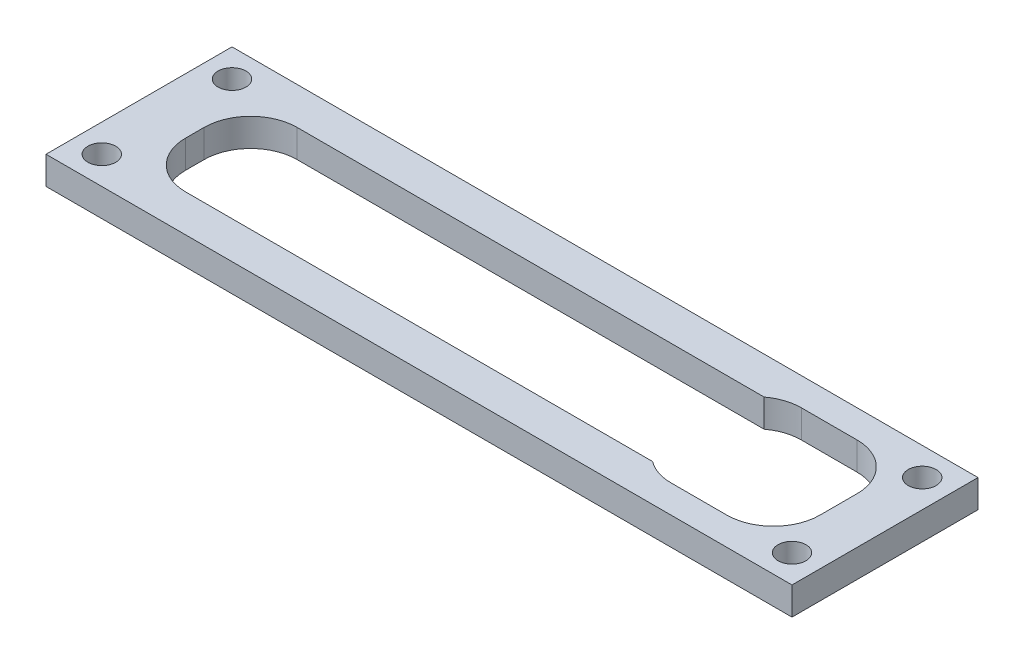
ISO-10303-21;
HEADER;
FILE_DESCRIPTION(('STEP AP214'),'2;1');
FILE_NAME('part.step','',(''),(''),'','','');
FILE_SCHEMA(('AUTOMOTIVE_DESIGN { 1 0 10303 214 1 1 1 1 }'));
ENDSEC;
DATA;
#1=APPLICATION_CONTEXT('core data for automotive mechanical design processes');
#2=APPLICATION_PROTOCOL_DEFINITION('international standard','automotive_design',2000,#1);
#3=PRODUCT_CONTEXT('',#1,'mechanical');
#4=PRODUCT('Part','Part','',(#3));
#5=PRODUCT_RELATED_PRODUCT_CATEGORY('part','',(#4));
#6=PRODUCT_DEFINITION_FORMATION('','',#4);
#7=PRODUCT_DEFINITION_CONTEXT('part definition',#1,'design');
#8=PRODUCT_DEFINITION('design','',#6,#7);
#9=PRODUCT_DEFINITION_SHAPE('','',#8);
#10=(LENGTH_UNIT() NAMED_UNIT(*) SI_UNIT(.MILLI.,.METRE.));
#11=(NAMED_UNIT(*) PLANE_ANGLE_UNIT() SI_UNIT($,.RADIAN.));
#12=(NAMED_UNIT(*) SI_UNIT($,.STERADIAN.) SOLID_ANGLE_UNIT());
#13=UNCERTAINTY_MEASURE_WITH_UNIT(LENGTH_MEASURE(1.E-05),#10,'distance_accuracy_value','');
#14=(GEOMETRIC_REPRESENTATION_CONTEXT(3) GLOBAL_UNCERTAINTY_ASSIGNED_CONTEXT((#13)) GLOBAL_UNIT_ASSIGNED_CONTEXT((#10,
#11,#12)) REPRESENTATION_CONTEXT('',''));
#15=CARTESIAN_POINT('',(0.,0.,0.));
#16=DIRECTION('',(0.,0.,1.));
#17=DIRECTION('',(1.,0.,0.));
#18=AXIS2_PLACEMENT_3D('',#15,#16,#17);
#19=CARTESIAN_POINT('',(0.,3.,0.));
#20=DIRECTION('',(0.,-1.,0.));
#21=DIRECTION('',(0.,0.,-1.));
#22=AXIS2_PLACEMENT_3D('',#19,#20,#21);
#23=PLANE('',#22);
#24=DIRECTION('',(0.,0.,1.));
#25=VECTOR('',#24,1.);
#26=CARTESIAN_POINT('',(0.,3.,0.));
#27=LINE('',#26,#25);
#28=CARTESIAN_POINT('',(0.,3.,-20.));
#29=VERTEX_POINT('',#28);
#30=CARTESIAN_POINT('',(0.,3.,0.));
#31=VERTEX_POINT('',#30);
#32=EDGE_CURVE('E250',#29,#31,#27,.T.);
#33=ORIENTED_EDGE('',*,*,#32,.T.);
#34=DIRECTION('',(1.,0.,0.));
#35=VECTOR('',#34,1.);
#36=CARTESIAN_POINT('',(0.,3.,0.));
#37=LINE('',#36,#35);
#38=CARTESIAN_POINT('',(80.2139109024275,3.,0.));
#39=VERTEX_POINT('',#38);
#40=EDGE_CURVE('E253',#31,#39,#37,.T.);
#41=ORIENTED_EDGE('',*,*,#40,.T.);
#42=DIRECTION('',(0.,0.,-1.));
#43=VECTOR('',#42,1.);
#44=CARTESIAN_POINT('',(80.2139109024275,3.,0.));
#45=LINE('',#44,#43);
#46=CARTESIAN_POINT('',(80.2139109024275,3.,-20.));
#47=VERTEX_POINT('',#46);
#48=EDGE_CURVE('E256',#39,#47,#45,.T.);
#49=ORIENTED_EDGE('',*,*,#48,.T.);
#50=DIRECTION('',(-1.,0.,0.));
#51=VECTOR('',#50,1.);
#52=CARTESIAN_POINT('',(0.,3.,-20.));
#53=LINE('',#52,#51);
#54=EDGE_CURVE('E258',#47,#29,#53,.T.);
#55=ORIENTED_EDGE('',*,*,#54,.T.);
#56=EDGE_LOOP('',(#33,#41,#49,#55));
#57=FACE_BOUND('',#56,.T.);
#58=DIRECTION('',(-1.,0.,0.));
#59=VECTOR('',#58,1.);
#60=CARTESIAN_POINT('',(5.99999999999999,3.,-16.));
#61=LINE('',#60,#59);
#62=CARTESIAN_POINT('',(61.2139109024274,3.,-16.));
#63=VERTEX_POINT('',#62);
#64=CARTESIAN_POINT('',(11.,3.,-16.));
#65=VERTEX_POINT('',#64);
#66=EDGE_CURVE('E243',#63,#65,#61,.T.);
#67=ORIENTED_EDGE('',*,*,#66,.F.);
#68=CARTESIAN_POINT('',(64.2139109024274,3.,-12.));
#69=DIRECTION('',(0.,-1.,0.));
#70=DIRECTION('',(0.,0.,-1.));
#71=AXIS2_PLACEMENT_3D('',#68,#69,#70);
#72=CIRCLE('',#71,5.);
#73=CARTESIAN_POINT('',(64.2139109024274,3.,-17.));
#74=VERTEX_POINT('',#73);
#75=EDGE_CURVE('E193',#63,#74,#72,.T.);
#76=ORIENTED_EDGE('',*,*,#75,.T.);
#77=DIRECTION('',(-1.,0.,0.));
#78=VECTOR('',#77,1.);
#79=CARTESIAN_POINT('',(61.2139109024274,3.,-17.));
#80=LINE('',#79,#78);
#81=CARTESIAN_POINT('',(70.2139109024274,3.,-17.));
#82=VERTEX_POINT('',#81);
#83=EDGE_CURVE('E205',#82,#74,#80,.T.);
#84=ORIENTED_EDGE('',*,*,#83,.F.);
#85=CARTESIAN_POINT('',(70.2139109024274,3.,-12.));
#86=DIRECTION('',(0.,-1.,0.));
#87=DIRECTION('',(0.,0.,-1.));
#88=AXIS2_PLACEMENT_3D('',#85,#86,#87);
#89=CIRCLE('',#88,5.);
#90=CARTESIAN_POINT('',(75.2139109024274,3.,-12.));
#91=VERTEX_POINT('',#90);
#92=EDGE_CURVE('E185',#82,#91,#89,.T.);
#93=ORIENTED_EDGE('',*,*,#92,.T.);
#94=DIRECTION('',(0.,0.,-1.));
#95=VECTOR('',#94,1.);
#96=CARTESIAN_POINT('',(75.2139109024274,3.,-17.));
#97=LINE('',#96,#95);
#98=CARTESIAN_POINT('',(75.2139109024274,3.,-8.00000000000002));
#99=VERTEX_POINT('',#98);
#100=EDGE_CURVE('E202',#99,#91,#97,.T.);
#101=ORIENTED_EDGE('',*,*,#100,.F.);
#102=CARTESIAN_POINT('',(70.2139109024274,3.,-8.00000000000002));
#103=DIRECTION('',(0.,-1.,0.));
#104=DIRECTION('',(0.,0.,-1.));
#105=AXIS2_PLACEMENT_3D('',#102,#103,#104);
#106=CIRCLE('',#105,5.);
#107=CARTESIAN_POINT('',(70.2139109024274,3.,-3.00000000000001));
#108=VERTEX_POINT('',#107);
#109=EDGE_CURVE('E189',#99,#108,#106,.T.);
#110=ORIENTED_EDGE('',*,*,#109,.T.);
#111=DIRECTION('',(1.,0.,0.));
#112=VECTOR('',#111,1.);
#113=CARTESIAN_POINT('',(61.2139109024274,3.,-3.00000000000001));
#114=LINE('',#113,#112);
#115=CARTESIAN_POINT('',(64.2139109024274,3.,-3.00000000000001));
#116=VERTEX_POINT('',#115);
#117=EDGE_CURVE('E200',#116,#108,#114,.T.);
#118=ORIENTED_EDGE('',*,*,#117,.F.);
#119=CARTESIAN_POINT('',(64.2139109024274,3.,-8.00000000000001));
#120=DIRECTION('',(0.,-1.,0.));
#121=DIRECTION('',(0.,0.,-1.));
#122=AXIS2_PLACEMENT_3D('',#119,#120,#121);
#123=CIRCLE('',#122,5.);
#124=CARTESIAN_POINT('',(61.2139109024274,3.,-4.00000000000001));
#125=VERTEX_POINT('',#124);
#126=EDGE_CURVE('E43',#116,#125,#123,.T.);
#127=ORIENTED_EDGE('',*,*,#126,.T.);
#128=DIRECTION('',(1.,0.,0.));
#129=VECTOR('',#128,1.);
#130=CARTESIAN_POINT('',(5.99999999999999,3.,-4.00000000000002));
#131=LINE('',#130,#129);
#132=CARTESIAN_POINT('',(11.,3.,-4.00000000000002));
#133=VERTEX_POINT('',#132);
#134=EDGE_CURVE('E162',#133,#125,#131,.T.);
#135=ORIENTED_EDGE('',*,*,#134,.F.);
#136=CARTESIAN_POINT('',(11.,3.,-9.00000000000001));
#137=DIRECTION('',(0.,-1.,0.));
#138=DIRECTION('',(0.,0.,-1.));
#139=AXIS2_PLACEMENT_3D('',#136,#137,#138);
#140=CIRCLE('',#139,5.);
#141=CARTESIAN_POINT('',(5.99999999999999,3.,-9.00000000000001));
#142=VERTEX_POINT('',#141);
#143=EDGE_CURVE('E179',#133,#142,#140,.T.);
#144=ORIENTED_EDGE('',*,*,#143,.T.);
#145=DIRECTION('',(0.,0.,1.));
#146=VECTOR('',#145,1.);
#147=CARTESIAN_POINT('',(5.99999999999999,3.,-16.));
#148=LINE('',#147,#146);
#149=CARTESIAN_POINT('',(5.99999999999999,3.,-11.));
#150=VERTEX_POINT('',#149);
#151=EDGE_CURVE('E239',#150,#142,#148,.T.);
#152=ORIENTED_EDGE('',*,*,#151,.F.);
#153=CARTESIAN_POINT('',(11.,3.,-11.));
#154=DIRECTION('',(0.,-1.,0.));
#155=DIRECTION('',(0.,0.,-1.));
#156=AXIS2_PLACEMENT_3D('',#153,#154,#155);
#157=CIRCLE('',#156,5.);
#158=EDGE_CURVE('E183',#150,#65,#157,.T.);
#159=ORIENTED_EDGE('',*,*,#158,.T.);
#160=EDGE_LOOP('',(#67,#76,#84,#93,#101,#110,#118,#127,#135,#144,#152,#159));
#161=FACE_BOUND('',#160,.T.);
#162=CARTESIAN_POINT('',(3.,3.,-17.));
#163=DIRECTION('',(0.,1.,0.));
#164=DIRECTION('',(0.,0.,1.));
#165=AXIS2_PLACEMENT_3D('',#162,#163,#164);
#166=CIRCLE('',#165,1.5);
#167=CARTESIAN_POINT('',(3.,3.,-15.5));
#168=VERTEX_POINT('',#167);
#169=EDGE_CURVE('E234',#168,#168,#166,.T.);
#170=ORIENTED_EDGE('',*,*,#169,.F.);
#171=EDGE_LOOP('',(#170));
#172=FACE_BOUND('',#171,.T.);
#173=CARTESIAN_POINT('',(3.,3.,-3.));
#174=DIRECTION('',(0.,1.,0.));
#175=DIRECTION('',(0.,0.,-1.));
#176=AXIS2_PLACEMENT_3D('',#173,#174,#175);
#177=CIRCLE('',#176,1.5);
#178=CARTESIAN_POINT('',(3.,3.,-4.5));
#179=VERTEX_POINT('',#178);
#180=EDGE_CURVE('E228',#179,#179,#177,.T.);
#181=ORIENTED_EDGE('',*,*,#180,.F.);
#182=EDGE_LOOP('',(#181));
#183=FACE_BOUND('',#182,.T.);
#184=CARTESIAN_POINT('',(77.2139109024275,3.,-3.00000000000001));
#185=DIRECTION('',(0.,1.,0.));
#186=DIRECTION('',(0.,0.,1.));
#187=AXIS2_PLACEMENT_3D('',#184,#185,#186);
#188=CIRCLE('',#187,1.5);
#189=CARTESIAN_POINT('',(77.2139109024275,3.,-1.50000000000001));
#190=VERTEX_POINT('',#189);
#191=EDGE_CURVE('E222',#190,#190,#188,.T.);
#192=ORIENTED_EDGE('',*,*,#191,.F.);
#193=EDGE_LOOP('',(#192));
#194=FACE_BOUND('',#193,.T.);
#195=CARTESIAN_POINT('',(77.2139109024275,3.,-17.));
#196=DIRECTION('',(0.,1.,0.));
#197=DIRECTION('',(0.,0.,-1.));
#198=AXIS2_PLACEMENT_3D('',#195,#196,#197);
#199=CIRCLE('',#198,1.5);
#200=CARTESIAN_POINT('',(77.2139109024275,3.,-18.5));
#201=VERTEX_POINT('',#200);
#202=EDGE_CURVE('E216',#201,#201,#199,.T.);
#203=ORIENTED_EDGE('',*,*,#202,.F.);
#204=EDGE_LOOP('',(#203));
#205=FACE_BOUND('',#204,.T.);
#206=ADVANCED_FACE('F35',(#57,#161,#172,#183,#194,#205),#23,.F.);
#207=CARTESIAN_POINT('',(0.,0.,0.));
#208=DIRECTION('',(0.,-1.,0.));
#209=DIRECTION('',(0.,0.,-1.));
#210=AXIS2_PLACEMENT_3D('',#207,#208,#209);
#211=PLANE('',#210);
#212=DIRECTION('',(-1.,0.,0.));
#213=VECTOR('',#212,1.);
#214=CARTESIAN_POINT('',(61.2139109024274,0.,-17.));
#215=LINE('',#214,#213);
#216=CARTESIAN_POINT('',(70.2139109024274,0.,-17.));
#217=VERTEX_POINT('',#216);
#218=CARTESIAN_POINT('',(64.2139109024274,0.,-17.));
#219=VERTEX_POINT('',#218);
#220=EDGE_CURVE('E165',#217,#219,#215,.T.);
#221=ORIENTED_EDGE('',*,*,#220,.T.);
#222=CARTESIAN_POINT('',(64.2139109024274,0.,-12.));
#223=DIRECTION('',(0.,-1.,0.));
#224=DIRECTION('',(0.,0.,-1.));
#225=AXIS2_PLACEMENT_3D('',#222,#223,#224);
#226=CIRCLE('',#225,5.);
#227=CARTESIAN_POINT('',(61.2139109024274,0.,-16.));
#228=VERTEX_POINT('',#227);
#229=EDGE_CURVE('E195',#219,#228,#226,.F.);
#230=ORIENTED_EDGE('',*,*,#229,.T.);
#231=DIRECTION('',(-1.,0.,0.));
#232=VECTOR('',#231,1.);
#233=CARTESIAN_POINT('',(5.99999999999999,0.,-16.));
#234=LINE('',#233,#232);
#235=CARTESIAN_POINT('',(11.,0.,-16.));
#236=VERTEX_POINT('',#235);
#237=EDGE_CURVE('E154',#228,#236,#234,.T.);
#238=ORIENTED_EDGE('',*,*,#237,.T.);
#239=CARTESIAN_POINT('',(11.,0.,-11.));
#240=DIRECTION('',(0.,-1.,0.));
#241=DIRECTION('',(0.,0.,-1.));
#242=AXIS2_PLACEMENT_3D('',#239,#240,#241);
#243=CIRCLE('',#242,5.);
#244=CARTESIAN_POINT('',(5.99999999999999,0.,-11.));
#245=VERTEX_POINT('',#244);
#246=EDGE_CURVE('E181',#236,#245,#243,.F.);
#247=ORIENTED_EDGE('',*,*,#246,.T.);
#248=DIRECTION('',(0.,0.,1.));
#249=VECTOR('',#248,1.);
#250=CARTESIAN_POINT('',(5.99999999999999,0.,-16.));
#251=LINE('',#250,#249);
#252=CARTESIAN_POINT('',(5.99999999999999,0.,-9.00000000000001));
#253=VERTEX_POINT('',#252);
#254=EDGE_CURVE('E155',#245,#253,#251,.T.);
#255=ORIENTED_EDGE('',*,*,#254,.T.);
#256=CARTESIAN_POINT('',(11.,0.,-9.00000000000001));
#257=DIRECTION('',(0.,-1.,0.));
#258=DIRECTION('',(0.,0.,-1.));
#259=AXIS2_PLACEMENT_3D('',#256,#257,#258);
#260=CIRCLE('',#259,5.);
#261=CARTESIAN_POINT('',(11.,0.,-4.00000000000002));
#262=VERTEX_POINT('',#261);
#263=EDGE_CURVE('E151',#253,#262,#260,.F.);
#264=ORIENTED_EDGE('',*,*,#263,.T.);
#265=DIRECTION('',(1.,0.,0.));
#266=VECTOR('',#265,1.);
#267=CARTESIAN_POINT('',(5.99999999999999,0.,-4.00000000000002));
#268=LINE('',#267,#266);
#269=CARTESIAN_POINT('',(61.2139109024274,0.,-4.00000000000001));
#270=VERTEX_POINT('',#269);
#271=EDGE_CURVE('E145',#262,#270,#268,.T.);
#272=ORIENTED_EDGE('',*,*,#271,.T.);
#273=CARTESIAN_POINT('',(64.2139109024274,0.,-8.00000000000001));
#274=DIRECTION('',(0.,-1.,0.));
#275=DIRECTION('',(0.,0.,-1.));
#276=AXIS2_PLACEMENT_3D('',#273,#274,#275);
#277=CIRCLE('',#276,5.);
#278=CARTESIAN_POINT('',(64.2139109024274,0.,-3.00000000000001));
#279=VERTEX_POINT('',#278);
#280=EDGE_CURVE('E11',#270,#279,#277,.F.);
#281=ORIENTED_EDGE('',*,*,#280,.T.);
#282=DIRECTION('',(1.,0.,0.));
#283=VECTOR('',#282,1.);
#284=CARTESIAN_POINT('',(61.2139109024274,0.,-3.00000000000001));
#285=LINE('',#284,#283);
#286=CARTESIAN_POINT('',(70.2139109024274,0.,-3.00000000000001));
#287=VERTEX_POINT('',#286);
#288=EDGE_CURVE('E212',#279,#287,#285,.T.);
#289=ORIENTED_EDGE('',*,*,#288,.T.);
#290=CARTESIAN_POINT('',(70.2139109024274,0.,-8.00000000000002));
#291=DIRECTION('',(0.,-1.,0.));
#292=DIRECTION('',(0.,0.,-1.));
#293=AXIS2_PLACEMENT_3D('',#290,#291,#292);
#294=CIRCLE('',#293,5.);
#295=CARTESIAN_POINT('',(75.2139109024274,0.,-8.00000000000002));
#296=VERTEX_POINT('',#295);
#297=EDGE_CURVE('E191',#287,#296,#294,.F.);
#298=ORIENTED_EDGE('',*,*,#297,.T.);
#299=DIRECTION('',(0.,0.,-1.));
#300=VECTOR('',#299,1.);
#301=CARTESIAN_POINT('',(75.2139109024274,0.,-17.));
#302=LINE('',#301,#300);
#303=CARTESIAN_POINT('',(75.2139109024274,0.,-12.));
#304=VERTEX_POINT('',#303);
#305=EDGE_CURVE('E300',#296,#304,#302,.T.);
#306=ORIENTED_EDGE('',*,*,#305,.T.);
#307=CARTESIAN_POINT('',(70.2139109024274,0.,-12.));
#308=DIRECTION('',(0.,-1.,0.));
#309=DIRECTION('',(0.,0.,-1.));
#310=AXIS2_PLACEMENT_3D('',#307,#308,#309);
#311=CIRCLE('',#310,5.);
#312=EDGE_CURVE('E187',#304,#217,#311,.F.);
#313=ORIENTED_EDGE('',*,*,#312,.T.);
#314=EDGE_LOOP('',(#221,#230,#238,#247,#255,#264,#272,#281,#289,#298,#306,#313));
#315=FACE_BOUND('',#314,.T.);
#316=CARTESIAN_POINT('',(77.2139109024275,0.,-3.00000000000001));
#317=DIRECTION('',(0.,1.,0.));
#318=DIRECTION('',(0.,0.,1.));
#319=AXIS2_PLACEMENT_3D('',#316,#317,#318);
#320=CIRCLE('',#319,1.5);
#321=CARTESIAN_POINT('',(77.2139109024275,0.,-1.50000000000001));
#322=VERTEX_POINT('',#321);
#323=EDGE_CURVE('E219',#322,#322,#320,.T.);
#324=ORIENTED_EDGE('',*,*,#323,.T.);
#325=EDGE_LOOP('',(#324));
#326=FACE_BOUND('',#325,.T.);
#327=CARTESIAN_POINT('',(3.,0.,-17.));
#328=DIRECTION('',(0.,1.,0.));
#329=DIRECTION('',(0.,0.,1.));
#330=AXIS2_PLACEMENT_3D('',#327,#328,#329);
#331=CIRCLE('',#330,1.5);
#332=CARTESIAN_POINT('',(3.,0.,-15.5));
#333=VERTEX_POINT('',#332);
#334=EDGE_CURVE('E231',#333,#333,#331,.T.);
#335=ORIENTED_EDGE('',*,*,#334,.T.);
#336=EDGE_LOOP('',(#335));
#337=FACE_BOUND('',#336,.T.);
#338=DIRECTION('',(0.,0.,1.));
#339=VECTOR('',#338,1.);
#340=CARTESIAN_POINT('',(0.,0.,0.));
#341=LINE('',#340,#339);
#342=CARTESIAN_POINT('',(0.,0.,-20.));
#343=VERTEX_POINT('',#342);
#344=CARTESIAN_POINT('',(0.,0.,0.));
#345=VERTEX_POINT('',#344);
#346=EDGE_CURVE('E246',#343,#345,#341,.T.);
#347=ORIENTED_EDGE('',*,*,#346,.F.);
#348=DIRECTION('',(-1.,0.,0.));
#349=VECTOR('',#348,1.);
#350=CARTESIAN_POINT('',(0.,0.,-20.));
#351=LINE('',#350,#349);
#352=CARTESIAN_POINT('',(80.2139109024275,0.,-20.));
#353=VERTEX_POINT('',#352);
#354=EDGE_CURVE('E254',#353,#343,#351,.T.);
#355=ORIENTED_EDGE('',*,*,#354,.F.);
#356=DIRECTION('',(0.,0.,-1.));
#357=VECTOR('',#356,1.);
#358=CARTESIAN_POINT('',(80.2139109024275,0.,0.));
#359=LINE('',#358,#357);
#360=CARTESIAN_POINT('',(80.2139109024275,0.,0.));
#361=VERTEX_POINT('',#360);
#362=EDGE_CURVE('E265',#361,#353,#359,.T.);
#363=ORIENTED_EDGE('',*,*,#362,.F.);
#364=DIRECTION('',(1.,0.,0.));
#365=VECTOR('',#364,1.);
#366=CARTESIAN_POINT('',(0.,0.,0.));
#367=LINE('',#366,#365);
#368=EDGE_CURVE('E263',#345,#361,#367,.T.);
#369=ORIENTED_EDGE('',*,*,#368,.F.);
#370=EDGE_LOOP('',(#347,#355,#363,#369));
#371=FACE_BOUND('',#370,.T.);
#372=CARTESIAN_POINT('',(3.,0.,-3.));
#373=DIRECTION('',(0.,1.,0.));
#374=DIRECTION('',(0.,0.,-1.));
#375=AXIS2_PLACEMENT_3D('',#372,#373,#374);
#376=CIRCLE('',#375,1.5);
#377=CARTESIAN_POINT('',(3.,0.,-4.5));
#378=VERTEX_POINT('',#377);
#379=EDGE_CURVE('E225',#378,#378,#376,.T.);
#380=ORIENTED_EDGE('',*,*,#379,.T.);
#381=EDGE_LOOP('',(#380));
#382=FACE_BOUND('',#381,.T.);
#383=CARTESIAN_POINT('',(77.2139109024275,0.,-17.));
#384=DIRECTION('',(0.,1.,0.));
#385=DIRECTION('',(0.,0.,-1.));
#386=AXIS2_PLACEMENT_3D('',#383,#384,#385);
#387=CIRCLE('',#386,1.5);
#388=CARTESIAN_POINT('',(77.2139109024275,0.,-18.5));
#389=VERTEX_POINT('',#388);
#390=EDGE_CURVE('E214',#389,#389,#387,.T.);
#391=ORIENTED_EDGE('',*,*,#390,.T.);
#392=EDGE_LOOP('',(#391));
#393=FACE_BOUND('',#392,.T.);
#394=ADVANCED_FACE('F148',(#315,#326,#337,#371,#382,#393),#211,.T.);
#395=CARTESIAN_POINT('',(0.,3.,0.));
#396=DIRECTION('',(1.,0.,0.));
#397=DIRECTION('',(0.,0.,-1.));
#398=AXIS2_PLACEMENT_3D('',#395,#396,#397);
#399=PLANE('',#398);
#400=ORIENTED_EDGE('',*,*,#346,.T.);
#401=DIRECTION('',(0.,-1.,0.));
#402=VECTOR('',#401,1.);
#403=CARTESIAN_POINT('',(0.,3.,0.));
#404=LINE('',#403,#402);
#405=EDGE_CURVE('E276',#31,#345,#404,.T.);
#406=ORIENTED_EDGE('',*,*,#405,.F.);
#407=ORIENTED_EDGE('',*,*,#32,.F.);
#408=DIRECTION('',(0.,-1.,0.));
#409=VECTOR('',#408,1.);
#410=CARTESIAN_POINT('',(0.,3.,-20.));
#411=LINE('',#410,#409);
#412=EDGE_CURVE('E260',#29,#343,#411,.T.);
#413=ORIENTED_EDGE('',*,*,#412,.T.);
#414=EDGE_LOOP('',(#400,#406,#407,#413));
#415=FACE_BOUND('',#414,.T.);
#416=ADVANCED_FACE('F331',(#415),#399,.F.);
#417=CARTESIAN_POINT('',(0.,3.,0.));
#418=DIRECTION('',(0.,0.,-1.));
#419=DIRECTION('',(-1.,0.,0.));
#420=AXIS2_PLACEMENT_3D('',#417,#418,#419);
#421=PLANE('',#420);
#422=ORIENTED_EDGE('',*,*,#368,.T.);
#423=DIRECTION('',(0.,-1.,0.));
#424=VECTOR('',#423,1.);
#425=CARTESIAN_POINT('',(80.2139109024275,3.,0.));
#426=LINE('',#425,#424);
#427=EDGE_CURVE('E273',#39,#361,#426,.T.);
#428=ORIENTED_EDGE('',*,*,#427,.F.);
#429=ORIENTED_EDGE('',*,*,#40,.F.);
#430=ORIENTED_EDGE('',*,*,#405,.T.);
#431=EDGE_LOOP('',(#422,#428,#429,#430));
#432=FACE_BOUND('',#431,.T.);
#433=ADVANCED_FACE('F344',(#432),#421,.F.);
#434=CARTESIAN_POINT('',(80.2139109024275,3.,0.));
#435=DIRECTION('',(-1.,0.,0.));
#436=DIRECTION('',(0.,0.,1.));
#437=AXIS2_PLACEMENT_3D('',#434,#435,#436);
#438=PLANE('',#437);
#439=ORIENTED_EDGE('',*,*,#362,.T.);
#440=DIRECTION('',(0.,-1.,0.));
#441=VECTOR('',#440,1.);
#442=CARTESIAN_POINT('',(80.2139109024275,3.,-20.));
#443=LINE('',#442,#441);
#444=EDGE_CURVE('E270',#47,#353,#443,.T.);
#445=ORIENTED_EDGE('',*,*,#444,.F.);
#446=ORIENTED_EDGE('',*,*,#48,.F.);
#447=ORIENTED_EDGE('',*,*,#427,.T.);
#448=EDGE_LOOP('',(#439,#445,#446,#447));
#449=FACE_BOUND('',#448,.T.);
#450=ADVANCED_FACE('F340',(#449),#438,.F.);
#451=CARTESIAN_POINT('',(0.,3.,-20.));
#452=DIRECTION('',(0.,0.,1.));
#453=DIRECTION('',(1.,0.,0.));
#454=AXIS2_PLACEMENT_3D('',#451,#452,#453);
#455=PLANE('',#454);
#456=ORIENTED_EDGE('',*,*,#354,.T.);
#457=ORIENTED_EDGE('',*,*,#412,.F.);
#458=ORIENTED_EDGE('',*,*,#54,.F.);
#459=ORIENTED_EDGE('',*,*,#444,.T.);
#460=EDGE_LOOP('',(#456,#457,#458,#459));
#461=FACE_BOUND('',#460,.T.);
#462=ADVANCED_FACE('F337',(#461),#455,.F.);
#463=CARTESIAN_POINT('',(5.99999999999999,3.,-16.));
#464=DIRECTION('',(1.,0.,0.));
#465=DIRECTION('',(0.,0.,-1.));
#466=AXIS2_PLACEMENT_3D('',#463,#464,#465);
#467=PLANE('',#466);
#468=ORIENTED_EDGE('',*,*,#151,.T.);
#469=DIRECTION('',(0.,-1.,0.));
#470=VECTOR('',#469,1.);
#471=CARTESIAN_POINT('',(5.99999999999999,0.,-9.00000000000001));
#472=LINE('',#471,#470);
#473=EDGE_CURVE('E281',#142,#253,#472,.T.);
#474=ORIENTED_EDGE('',*,*,#473,.T.);
#475=ORIENTED_EDGE('',*,*,#254,.F.);
#476=DIRECTION('',(0.,-1.,0.));
#477=VECTOR('',#476,1.);
#478=CARTESIAN_POINT('',(5.99999999999999,3.,-11.));
#479=LINE('',#478,#477);
#480=EDGE_CURVE('E279',#245,#150,#479,.F.);
#481=ORIENTED_EDGE('',*,*,#480,.T.);
#482=EDGE_LOOP('',(#468,#474,#475,#481));
#483=FACE_BOUND('',#482,.T.);
#484=ADVANCED_FACE('F334',(#483),#467,.T.);
#485=CARTESIAN_POINT('',(5.99999999999999,3.,-4.00000000000002));
#486=DIRECTION('',(0.,0.,-1.));
#487=DIRECTION('',(-1.,0.,0.));
#488=AXIS2_PLACEMENT_3D('',#485,#486,#487);
#489=PLANE('',#488);
#490=ORIENTED_EDGE('',*,*,#271,.F.);
#491=DIRECTION('',(0.,-1.,0.));
#492=VECTOR('',#491,1.);
#493=CARTESIAN_POINT('',(11.,3.,-4.00000000000002));
#494=LINE('',#493,#492);
#495=EDGE_CURVE('E284',#262,#133,#494,.F.);
#496=ORIENTED_EDGE('',*,*,#495,.T.);
#497=ORIENTED_EDGE('',*,*,#134,.T.);
#498=DIRECTION('',(0.,1.,0.));
#499=VECTOR('',#498,1.);
#500=CARTESIAN_POINT('',(61.2139109024274,0.,-4.00000000000001));
#501=LINE('',#500,#499);
#502=EDGE_CURVE('E159',#270,#125,#501,.T.);
#503=ORIENTED_EDGE('',*,*,#502,.F.);
#504=EDGE_LOOP('',(#490,#496,#497,#503));
#505=FACE_BOUND('',#504,.T.);
#506=ADVANCED_FACE('F160',(#505),#489,.T.);
#507=CARTESIAN_POINT('',(5.99999999999999,3.,-16.));
#508=DIRECTION('',(0.,0.,1.));
#509=DIRECTION('',(1.,0.,0.));
#510=AXIS2_PLACEMENT_3D('',#507,#508,#509);
#511=PLANE('',#510);
#512=ORIENTED_EDGE('',*,*,#66,.T.);
#513=DIRECTION('',(0.,-1.,0.));
#514=VECTOR('',#513,1.);
#515=CARTESIAN_POINT('',(11.,0.,-16.));
#516=LINE('',#515,#514);
#517=EDGE_CURVE('E286',#65,#236,#516,.T.);
#518=ORIENTED_EDGE('',*,*,#517,.T.);
#519=ORIENTED_EDGE('',*,*,#237,.F.);
#520=DIRECTION('',(0.,1.,0.));
#521=VECTOR('',#520,1.);
#522=CARTESIAN_POINT('',(61.2139109024274,0.,-16.));
#523=LINE('',#522,#521);
#524=EDGE_CURVE('E164',#228,#63,#523,.T.);
#525=ORIENTED_EDGE('',*,*,#524,.T.);
#526=EDGE_LOOP('',(#512,#518,#519,#525));
#527=FACE_BOUND('',#526,.T.);
#528=ADVANCED_FACE('F366',(#527),#511,.T.);
#529=CARTESIAN_POINT('',(3.,3.,-17.));
#530=DIRECTION('',(0.,-1.,0.));
#531=DIRECTION('',(0.,0.,-1.));
#532=AXIS2_PLACEMENT_3D('',#529,#530,#531);
#533=CYLINDRICAL_SURFACE('',#532,1.5);
#534=ORIENTED_EDGE('',*,*,#169,.T.);
#535=EDGE_LOOP('',(#534));
#536=FACE_BOUND('',#535,.T.);
#537=ORIENTED_EDGE('',*,*,#334,.F.);
#538=EDGE_LOOP('',(#537));
#539=FACE_BOUND('',#538,.T.);
#540=ADVANCED_FACE('F379',(#536,#539),#533,.F.);
#541=CARTESIAN_POINT('',(3.,3.,-3.));
#542=DIRECTION('',(0.,-1.,0.));
#543=DIRECTION('',(0.,0.,-1.));
#544=AXIS2_PLACEMENT_3D('',#541,#542,#543);
#545=CYLINDRICAL_SURFACE('',#544,1.5);
#546=ORIENTED_EDGE('',*,*,#180,.T.);
#547=EDGE_LOOP('',(#546));
#548=FACE_BOUND('',#547,.T.);
#549=ORIENTED_EDGE('',*,*,#379,.F.);
#550=EDGE_LOOP('',(#549));
#551=FACE_BOUND('',#550,.T.);
#552=ADVANCED_FACE('F384',(#548,#551),#545,.F.);
#553=CARTESIAN_POINT('',(77.2139109024275,3.,-3.00000000000001));
#554=DIRECTION('',(0.,-1.,0.));
#555=DIRECTION('',(0.,0.,-1.));
#556=AXIS2_PLACEMENT_3D('',#553,#554,#555);
#557=CYLINDRICAL_SURFACE('',#556,1.5);
#558=ORIENTED_EDGE('',*,*,#191,.T.);
#559=EDGE_LOOP('',(#558));
#560=FACE_BOUND('',#559,.T.);
#561=ORIENTED_EDGE('',*,*,#323,.F.);
#562=EDGE_LOOP('',(#561));
#563=FACE_BOUND('',#562,.T.);
#564=ADVANCED_FACE('F388',(#560,#563),#557,.F.);
#565=CARTESIAN_POINT('',(77.2139109024275,3.,-17.));
#566=DIRECTION('',(0.,-1.,0.));
#567=DIRECTION('',(0.,0.,-1.));
#568=AXIS2_PLACEMENT_3D('',#565,#566,#567);
#569=CYLINDRICAL_SURFACE('',#568,1.5);
#570=ORIENTED_EDGE('',*,*,#202,.T.);
#571=EDGE_LOOP('',(#570));
#572=FACE_BOUND('',#571,.T.);
#573=ORIENTED_EDGE('',*,*,#390,.F.);
#574=EDGE_LOOP('',(#573));
#575=FACE_BOUND('',#574,.T.);
#576=ADVANCED_FACE('F392',(#572,#575),#569,.F.);
#577=CARTESIAN_POINT('',(61.2139109024274,0.,-17.));
#578=DIRECTION('',(0.,0.,-1.));
#579=DIRECTION('',(-1.,0.,0.));
#580=AXIS2_PLACEMENT_3D('',#577,#578,#579);
#581=PLANE('',#580);
#582=ORIENTED_EDGE('',*,*,#220,.F.);
#583=DIRECTION('',(0.,1.,0.));
#584=VECTOR('',#583,1.);
#585=CARTESIAN_POINT('',(70.2139109024274,3.,-17.));
#586=LINE('',#585,#584);
#587=EDGE_CURVE('E291',#217,#82,#586,.T.);
#588=ORIENTED_EDGE('',*,*,#587,.T.);
#589=ORIENTED_EDGE('',*,*,#83,.T.);
#590=DIRECTION('',(0.,1.,0.));
#591=VECTOR('',#590,1.);
#592=CARTESIAN_POINT('',(64.2139109024274,0.,-17.));
#593=LINE('',#592,#591);
#594=EDGE_CURVE('E289',#74,#219,#593,.F.);
#595=ORIENTED_EDGE('',*,*,#594,.T.);
#596=EDGE_LOOP('',(#582,#588,#589,#595));
#597=FACE_BOUND('',#596,.T.);
#598=ADVANCED_FACE('F310',(#597),#581,.F.);
#599=CARTESIAN_POINT('',(75.2139109024274,0.,-17.));
#600=DIRECTION('',(1.,0.,0.));
#601=DIRECTION('',(0.,0.,-1.));
#602=AXIS2_PLACEMENT_3D('',#599,#600,#601);
#603=PLANE('',#602);
#604=ORIENTED_EDGE('',*,*,#100,.T.);
#605=DIRECTION('',(0.,1.,0.));
#606=VECTOR('',#605,1.);
#607=CARTESIAN_POINT('',(75.2139109024274,0.,-12.));
#608=LINE('',#607,#606);
#609=EDGE_CURVE('E171',#91,#304,#608,.F.);
#610=ORIENTED_EDGE('',*,*,#609,.T.);
#611=ORIENTED_EDGE('',*,*,#305,.F.);
#612=DIRECTION('',(0.,1.,0.));
#613=VECTOR('',#612,1.);
#614=CARTESIAN_POINT('',(75.2139109024274,3.,-8.00000000000002));
#615=LINE('',#614,#613);
#616=EDGE_CURVE('E174',#296,#99,#615,.T.);
#617=ORIENTED_EDGE('',*,*,#616,.T.);
#618=EDGE_LOOP('',(#604,#610,#611,#617));
#619=FACE_BOUND('',#618,.T.);
#620=ADVANCED_FACE('F297',(#619),#603,.F.);
#621=CARTESIAN_POINT('',(61.2139109024274,0.,-3.00000000000001));
#622=DIRECTION('',(0.,0.,1.));
#623=DIRECTION('',(1.,0.,0.));
#624=AXIS2_PLACEMENT_3D('',#621,#622,#623);
#625=PLANE('',#624);
#626=ORIENTED_EDGE('',*,*,#117,.T.);
#627=DIRECTION('',(0.,1.,0.));
#628=VECTOR('',#627,1.);
#629=CARTESIAN_POINT('',(70.2139109024274,0.,-3.00000000000001));
#630=LINE('',#629,#628);
#631=EDGE_CURVE('E50',#108,#287,#630,.F.);
#632=ORIENTED_EDGE('',*,*,#631,.T.);
#633=ORIENTED_EDGE('',*,*,#288,.F.);
#634=DIRECTION('',(0.,-1.,0.));
#635=VECTOR('',#634,1.);
#636=CARTESIAN_POINT('',(64.2139109024274,0.,-3.00000000000001));
#637=LINE('',#636,#635);
#638=EDGE_CURVE('E169',#279,#116,#637,.F.);
#639=ORIENTED_EDGE('',*,*,#638,.T.);
#640=EDGE_LOOP('',(#626,#632,#633,#639));
#641=FACE_BOUND('',#640,.T.);
#642=ADVANCED_FACE('F355',(#641),#625,.F.);
#643=CARTESIAN_POINT('',(11.,3.,-9.00000000000001));
#644=DIRECTION('',(0.,1.,0.));
#645=DIRECTION('',(0.,0.,1.));
#646=AXIS2_PLACEMENT_3D('',#643,#644,#645);
#647=CYLINDRICAL_SURFACE('',#646,5.);
#648=ORIENTED_EDGE('',*,*,#143,.F.);
#649=ORIENTED_EDGE('',*,*,#495,.F.);
#650=ORIENTED_EDGE('',*,*,#263,.F.);
#651=ORIENTED_EDGE('',*,*,#473,.F.);
#652=EDGE_LOOP('',(#648,#649,#650,#651));
#653=FACE_BOUND('',#652,.T.);
#654=ADVANCED_FACE('F352',(#653),#647,.F.);
#655=CARTESIAN_POINT('',(11.,3.,-11.));
#656=DIRECTION('',(0.,1.,0.));
#657=DIRECTION('',(0.,0.,1.));
#658=AXIS2_PLACEMENT_3D('',#655,#656,#657);
#659=CYLINDRICAL_SURFACE('',#658,5.);
#660=ORIENTED_EDGE('',*,*,#158,.F.);
#661=ORIENTED_EDGE('',*,*,#480,.F.);
#662=ORIENTED_EDGE('',*,*,#246,.F.);
#663=ORIENTED_EDGE('',*,*,#517,.F.);
#664=EDGE_LOOP('',(#660,#661,#662,#663));
#665=FACE_BOUND('',#664,.T.);
#666=ADVANCED_FACE('F323',(#665),#659,.F.);
#667=CARTESIAN_POINT('',(70.2139109024274,0.,-12.));
#668=DIRECTION('',(0.,-1.,0.));
#669=DIRECTION('',(0.,0.,-1.));
#670=AXIS2_PLACEMENT_3D('',#667,#668,#669);
#671=CYLINDRICAL_SURFACE('',#670,5.);
#672=ORIENTED_EDGE('',*,*,#312,.F.);
#673=ORIENTED_EDGE('',*,*,#609,.F.);
#674=ORIENTED_EDGE('',*,*,#92,.F.);
#675=ORIENTED_EDGE('',*,*,#587,.F.);
#676=EDGE_LOOP('',(#672,#673,#674,#675));
#677=FACE_BOUND('',#676,.T.);
#678=ADVANCED_FACE('F307',(#677),#671,.F.);
#679=CARTESIAN_POINT('',(70.2139109024274,0.,-8.00000000000002));
#680=DIRECTION('',(0.,-1.,0.));
#681=DIRECTION('',(0.,0.,-1.));
#682=AXIS2_PLACEMENT_3D('',#679,#680,#681);
#683=CYLINDRICAL_SURFACE('',#682,5.);
#684=ORIENTED_EDGE('',*,*,#297,.F.);
#685=ORIENTED_EDGE('',*,*,#631,.F.);
#686=ORIENTED_EDGE('',*,*,#109,.F.);
#687=ORIENTED_EDGE('',*,*,#616,.F.);
#688=EDGE_LOOP('',(#684,#685,#686,#687));
#689=FACE_BOUND('',#688,.T.);
#690=ADVANCED_FACE('F314',(#689),#683,.F.);
#691=CARTESIAN_POINT('',(64.2139109024274,0.,-12.));
#692=DIRECTION('',(0.,1.,0.));
#693=DIRECTION('',(0.,0.,1.));
#694=AXIS2_PLACEMENT_3D('',#691,#692,#693);
#695=CYLINDRICAL_SURFACE('',#694,5.);
#696=ORIENTED_EDGE('',*,*,#229,.F.);
#697=ORIENTED_EDGE('',*,*,#594,.F.);
#698=ORIENTED_EDGE('',*,*,#75,.F.);
#699=ORIENTED_EDGE('',*,*,#524,.F.);
#700=EDGE_LOOP('',(#696,#697,#698,#699));
#701=FACE_BOUND('',#700,.T.);
#702=ADVANCED_FACE('F316',(#701),#695,.F.);
#703=CARTESIAN_POINT('',(64.2139109024274,0.,-8.00000000000001));
#704=DIRECTION('',(0.,-1.,0.));
#705=DIRECTION('',(0.,0.,-1.));
#706=AXIS2_PLACEMENT_3D('',#703,#704,#705);
#707=CYLINDRICAL_SURFACE('',#706,5.);
#708=ORIENTED_EDGE('',*,*,#280,.F.);
#709=ORIENTED_EDGE('',*,*,#502,.T.);
#710=ORIENTED_EDGE('',*,*,#126,.F.);
#711=ORIENTED_EDGE('',*,*,#638,.F.);
#712=EDGE_LOOP('',(#708,#709,#710,#711));
#713=FACE_BOUND('',#712,.T.);
#714=ADVANCED_FACE('F37',(#713),#707,.F.);
#715=CLOSED_SHELL('',(#206,#394,#416,#433,#450,#462,#484,#506,#528,#540,#552,#564,#576,#598,
#620,#642,#654,#666,#678,#690,#702,#714));
#716=MANIFOLD_SOLID_BREP('B2',#715);
#717=ADVANCED_BREP_SHAPE_REPRESENTATION('',(#18,#716),#14);
#718=SHAPE_DEFINITION_REPRESENTATION(#9,#717);
ENDSEC;
END-ISO-10303-21;
